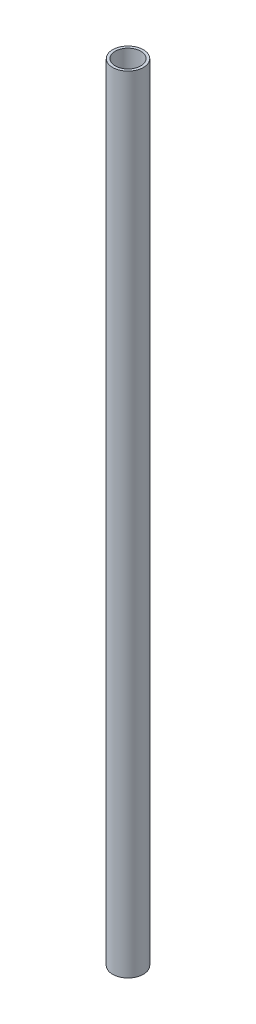
ISO-10303-21;
HEADER;
FILE_DESCRIPTION(('STEP AP214'),'2;1');
FILE_NAME('part.step','',(''),(''),'','','');
FILE_SCHEMA(('AUTOMOTIVE_DESIGN { 1 0 10303 214 1 1 1 1 }'));
ENDSEC;
DATA;
#1=APPLICATION_CONTEXT('core data for automotive mechanical design processes');
#2=APPLICATION_PROTOCOL_DEFINITION('international standard','automotive_design',2000,#1);
#3=PRODUCT_CONTEXT('',#1,'mechanical');
#4=PRODUCT('Part','Part','',(#3));
#5=PRODUCT_RELATED_PRODUCT_CATEGORY('part','',(#4));
#6=PRODUCT_DEFINITION_FORMATION('','',#4);
#7=PRODUCT_DEFINITION_CONTEXT('part definition',#1,'design');
#8=PRODUCT_DEFINITION('design','',#6,#7);
#9=PRODUCT_DEFINITION_SHAPE('','',#8);
#10=(LENGTH_UNIT() NAMED_UNIT(*) SI_UNIT(.MILLI.,.METRE.));
#11=(NAMED_UNIT(*) PLANE_ANGLE_UNIT() SI_UNIT($,.RADIAN.));
#12=(NAMED_UNIT(*) SI_UNIT($,.STERADIAN.) SOLID_ANGLE_UNIT());
#13=UNCERTAINTY_MEASURE_WITH_UNIT(LENGTH_MEASURE(1.E-05),#10,'distance_accuracy_value','');
#14=(GEOMETRIC_REPRESENTATION_CONTEXT(3) GLOBAL_UNCERTAINTY_ASSIGNED_CONTEXT((#13)) GLOBAL_UNIT_ASSIGNED_CONTEXT((#10,
#11,#12)) REPRESENTATION_CONTEXT('',''));
#15=CARTESIAN_POINT('',(0.,0.,0.));
#16=DIRECTION('',(0.,0.,1.));
#17=DIRECTION('',(1.,0.,0.));
#18=AXIS2_PLACEMENT_3D('',#15,#16,#17);
#19=CARTESIAN_POINT('',(0.,1075.69,0.));
#20=DIRECTION('',(0.,1.,0.));
#21=DIRECTION('',(0.,0.,1.));
#22=AXIS2_PLACEMENT_3D('',#19,#20,#21);
#23=PLANE('',#22);
#24=CARTESIAN_POINT('',(0.,1075.69,0.));
#25=DIRECTION('',(0.,1.,0.));
#26=DIRECTION('',(0.,0.,1.));
#27=AXIS2_PLACEMENT_3D('',#24,#25,#26);
#28=CIRCLE('',#27,21.082);
#29=CARTESIAN_POINT('',(0.,1075.69,21.082));
#30=VERTEX_POINT('',#29);
#31=EDGE_CURVE('E12',#30,#30,#28,.T.);
#32=ORIENTED_EDGE('',*,*,#31,.T.);
#33=EDGE_LOOP('',(#32));
#34=FACE_BOUND('',#33,.T.);
#35=CARTESIAN_POINT('',(0.,1075.69,0.));
#36=DIRECTION('',(0.,1.,0.));
#37=DIRECTION('',(0.,0.,1.));
#38=AXIS2_PLACEMENT_3D('',#35,#36,#37);
#39=CIRCLE('',#38,17.526);
#40=CARTESIAN_POINT('',(0.,1075.69,17.526));
#41=VERTEX_POINT('',#40);
#42=EDGE_CURVE('E53',#41,#41,#39,.T.);
#43=ORIENTED_EDGE('',*,*,#42,.F.);
#44=EDGE_LOOP('',(#43));
#45=FACE_BOUND('',#44,.T.);
#46=ADVANCED_FACE('F42',(#34,#45),#23,.T.);
#47=CARTESIAN_POINT('',(0.,0.,0.));
#48=DIRECTION('',(0.,1.,0.));
#49=DIRECTION('',(0.,0.,1.));
#50=AXIS2_PLACEMENT_3D('',#47,#48,#49);
#51=PLANE('',#50);
#52=CARTESIAN_POINT('',(0.,0.,0.));
#53=DIRECTION('',(0.,1.,0.));
#54=DIRECTION('',(0.,0.,1.));
#55=AXIS2_PLACEMENT_3D('',#52,#53,#54);
#56=CIRCLE('',#55,21.082);
#57=CARTESIAN_POINT('',(0.,0.,21.082));
#58=VERTEX_POINT('',#57);
#59=EDGE_CURVE('E46',#58,#58,#56,.T.);
#60=ORIENTED_EDGE('',*,*,#59,.F.);
#61=EDGE_LOOP('',(#60));
#62=FACE_BOUND('',#61,.T.);
#63=CARTESIAN_POINT('',(0.,0.,0.));
#64=DIRECTION('',(0.,1.,0.));
#65=DIRECTION('',(0.,0.,1.));
#66=AXIS2_PLACEMENT_3D('',#63,#64,#65);
#67=CIRCLE('',#66,17.526);
#68=CARTESIAN_POINT('',(0.,0.,17.526));
#69=VERTEX_POINT('',#68);
#70=EDGE_CURVE('E55',#69,#69,#67,.T.);
#71=ORIENTED_EDGE('',*,*,#70,.T.);
#72=EDGE_LOOP('',(#71));
#73=FACE_BOUND('',#72,.T.);
#74=ADVANCED_FACE('F65',(#62,#73),#51,.F.);
#75=CARTESIAN_POINT('',(0.,1075.69,0.));
#76=DIRECTION('',(0.,-1.,0.));
#77=DIRECTION('',(0.,0.,-1.));
#78=AXIS2_PLACEMENT_3D('',#75,#76,#77);
#79=CYLINDRICAL_SURFACE('',#78,21.082);
#80=ORIENTED_EDGE('',*,*,#31,.F.);
#81=EDGE_LOOP('',(#80));
#82=FACE_BOUND('',#81,.T.);
#83=ORIENTED_EDGE('',*,*,#59,.T.);
#84=EDGE_LOOP('',(#83));
#85=FACE_BOUND('',#84,.T.);
#86=ADVANCED_FACE('F44',(#82,#85),#79,.T.);
#87=CARTESIAN_POINT('',(0.,1075.69,0.));
#88=DIRECTION('',(0.,-1.,0.));
#89=DIRECTION('',(0.,0.,-1.));
#90=AXIS2_PLACEMENT_3D('',#87,#88,#89);
#91=CYLINDRICAL_SURFACE('',#90,17.526);
#92=ORIENTED_EDGE('',*,*,#42,.T.);
#93=EDGE_LOOP('',(#92));
#94=FACE_BOUND('',#93,.T.);
#95=ORIENTED_EDGE('',*,*,#70,.F.);
#96=EDGE_LOOP('',(#95));
#97=FACE_BOUND('',#96,.T.);
#98=ADVANCED_FACE('F61',(#94,#97),#91,.F.);
#99=CLOSED_SHELL('',(#46,#74,#86,#98));
#100=MANIFOLD_SOLID_BREP('B2',#99);
#101=ADVANCED_BREP_SHAPE_REPRESENTATION('',(#18,#100),#14);
#102=SHAPE_DEFINITION_REPRESENTATION(#9,#101);
ENDSEC;
END-ISO-10303-21;
